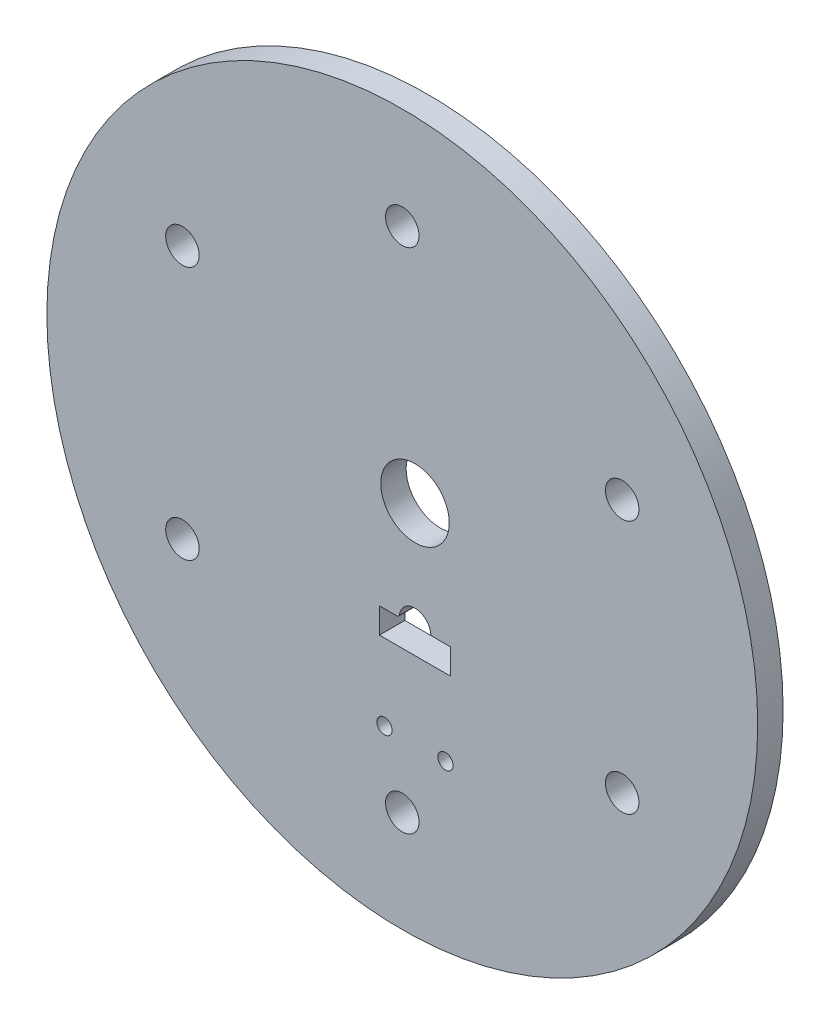
ISO-10303-21;
HEADER;
FILE_DESCRIPTION(('STEP AP214'),'2;1');
FILE_NAME('part.step','',(''),(''),'','','');
FILE_SCHEMA(('AUTOMOTIVE_DESIGN { 1 0 10303 214 1 1 1 1 }'));
ENDSEC;
DATA;
#1=APPLICATION_CONTEXT('core data for automotive mechanical design processes');
#2=APPLICATION_PROTOCOL_DEFINITION('international standard','automotive_design',2000,#1);
#3=PRODUCT_CONTEXT('',#1,'mechanical');
#4=PRODUCT('Part','Part','',(#3));
#5=PRODUCT_RELATED_PRODUCT_CATEGORY('part','',(#4));
#6=PRODUCT_DEFINITION_FORMATION('','',#4);
#7=PRODUCT_DEFINITION_CONTEXT('part definition',#1,'design');
#8=PRODUCT_DEFINITION('design','',#6,#7);
#9=PRODUCT_DEFINITION_SHAPE('','',#8);
#10=(LENGTH_UNIT() NAMED_UNIT(*) SI_UNIT(.MILLI.,.METRE.));
#11=(NAMED_UNIT(*) PLANE_ANGLE_UNIT() SI_UNIT($,.RADIAN.));
#12=(NAMED_UNIT(*) SI_UNIT($,.STERADIAN.) SOLID_ANGLE_UNIT());
#13=UNCERTAINTY_MEASURE_WITH_UNIT(LENGTH_MEASURE(1.E-05),#10,'distance_accuracy_value','');
#14=(GEOMETRIC_REPRESENTATION_CONTEXT(3) GLOBAL_UNCERTAINTY_ASSIGNED_CONTEXT((#13)) GLOBAL_UNIT_ASSIGNED_CONTEXT((#10,
#11,#12)) REPRESENTATION_CONTEXT('',''));
#15=CARTESIAN_POINT('',(0.,0.,0.));
#16=DIRECTION('',(0.,0.,1.));
#17=DIRECTION('',(1.,0.,0.));
#18=AXIS2_PLACEMENT_3D('',#15,#16,#17);
#19=CARTESIAN_POINT('',(9.5,-17.,5.));
#20=DIRECTION('',(0.,-1.,0.));
#21=DIRECTION('',(0.,0.,-1.));
#22=AXIS2_PLACEMENT_3D('',#19,#20,#21);
#23=PLANE('',#22);
#24=DIRECTION('',(-1.,0.,0.));
#25=VECTOR('',#24,1.);
#26=CARTESIAN_POINT('',(9.5,-17.,0.));
#27=LINE('',#26,#25);
#28=CARTESIAN_POINT('',(-1.06510869399518,-17.,0.));
#29=VERTEX_POINT('',#28);
#30=CARTESIAN_POINT('',(-4.5,-17.,0.));
#31=VERTEX_POINT('',#30);
#32=EDGE_CURVE('E147',#29,#31,#27,.T.);
#33=ORIENTED_EDGE('',*,*,#32,.F.);
#34=DIRECTION('',(0.,0.,1.));
#35=VECTOR('',#34,1.);
#36=CARTESIAN_POINT('',(-1.06510869399518,-17.,5.));
#37=LINE('',#36,#35);
#38=CARTESIAN_POINT('',(-1.06510869399518,-17.,5.));
#39=VERTEX_POINT('',#38);
#40=EDGE_CURVE('E64',#29,#39,#37,.T.);
#41=ORIENTED_EDGE('',*,*,#40,.T.);
#42=DIRECTION('',(-1.,0.,0.));
#43=VECTOR('',#42,1.);
#44=CARTESIAN_POINT('',(9.5,-17.,5.));
#45=LINE('',#44,#43);
#46=CARTESIAN_POINT('',(-4.5,-17.,5.));
#47=VERTEX_POINT('',#46);
#48=EDGE_CURVE('E134',#39,#47,#45,.T.);
#49=ORIENTED_EDGE('',*,*,#48,.T.);
#50=DIRECTION('',(0.,0.,-1.));
#51=VECTOR('',#50,1.);
#52=CARTESIAN_POINT('',(-4.5,-17.,5.));
#53=LINE('',#52,#51);
#54=EDGE_CURVE('E115',#47,#31,#53,.T.);
#55=ORIENTED_EDGE('',*,*,#54,.T.);
#56=EDGE_LOOP('',(#33,#41,#49,#55));
#57=FACE_BOUND('',#56,.T.);
#58=ADVANCED_FACE('F41',(#57),#23,.T.);
#59=CARTESIAN_POINT('',(0.,0.,5.));
#60=DIRECTION('',(0.,0.,1.));
#61=DIRECTION('',(1.,0.,0.));
#62=AXIS2_PLACEMENT_3D('',#59,#60,#61);
#63=PLANE('',#62);
#64=CARTESIAN_POINT('',(8.5,-37.,5.));
#65=DIRECTION('',(0.,0.,-1.));
#66=DIRECTION('',(-1.,0.,0.));
#67=AXIS2_PLACEMENT_3D('',#64,#65,#66);
#68=CIRCLE('',#67,1.5);
#69=CARTESIAN_POINT('',(7.,-37.,5.));
#70=VERTEX_POINT('',#69);
#71=EDGE_CURVE('E250',#70,#70,#68,.T.);
#72=ORIENTED_EDGE('',*,*,#71,.T.);
#73=EDGE_LOOP('',(#72));
#74=FACE_BOUND('',#73,.T.);
#75=CARTESIAN_POINT('',(-3.5,-37.,5.));
#76=DIRECTION('',(0.,0.,-1.));
#77=DIRECTION('',(-1.,0.,0.));
#78=AXIS2_PLACEMENT_3D('',#75,#76,#77);
#79=CIRCLE('',#78,1.5);
#80=CARTESIAN_POINT('',(-5.,-37.,5.));
#81=VERTEX_POINT('',#80);
#82=EDGE_CURVE('E254',#81,#81,#79,.T.);
#83=ORIENTED_EDGE('',*,*,#82,.T.);
#84=EDGE_LOOP('',(#83));
#85=FACE_BOUND('',#84,.T.);
#86=CARTESIAN_POINT('',(2.5,3.99999999999999,5.));
#87=DIRECTION('',(0.,0.,-1.));
#88=DIRECTION('',(-1.,0.,0.));
#89=AXIS2_PLACEMENT_3D('',#86,#87,#88);
#90=CIRCLE('',#89,6.74624);
#91=CARTESIAN_POINT('',(-4.24624,3.99999999999999,5.));
#92=VERTEX_POINT('',#91);
#93=EDGE_CURVE('E243',#92,#92,#90,.T.);
#94=ORIENTED_EDGE('',*,*,#93,.T.);
#95=EDGE_LOOP('',(#94));
#96=FACE_BOUND('',#95,.T.);
#97=ORIENTED_EDGE('',*,*,#48,.F.);
#98=CARTESIAN_POINT('',(-1.06510869399518,-16.5,5.));
#99=DIRECTION('',(0.,0.,1.));
#100=DIRECTION('',(1.,0.,0.));
#101=AXIS2_PLACEMENT_3D('',#98,#99,#100);
#102=CIRCLE('',#101,0.5);
#103=CARTESIAN_POINT('',(-0.56995470871807,-16.5694444444444,5.));
#104=VERTEX_POINT('',#103);
#105=EDGE_CURVE('E49',#39,#104,#102,.T.);
#106=ORIENTED_EDGE('',*,*,#105,.T.);
#107=CARTESIAN_POINT('',(2.5,-17.,5.));
#108=DIRECTION('',(0.,0.,-1.));
#109=DIRECTION('',(-1.,0.,0.));
#110=AXIS2_PLACEMENT_3D('',#107,#108,#109);
#111=CIRCLE('',#110,3.1);
#112=CARTESIAN_POINT('',(5.56995470871807,-16.5694444444444,5.));
#113=VERTEX_POINT('',#112);
#114=EDGE_CURVE('E142',#104,#113,#111,.T.);
#115=ORIENTED_EDGE('',*,*,#114,.T.);
#116=CARTESIAN_POINT('',(6.06510869399518,-16.5,5.));
#117=DIRECTION('',(0.,0.,1.));
#118=DIRECTION('',(1.,0.,0.));
#119=AXIS2_PLACEMENT_3D('',#116,#117,#118);
#120=CIRCLE('',#119,0.5);
#121=CARTESIAN_POINT('',(6.06510869399518,-17.,5.));
#122=VERTEX_POINT('',#121);
#123=EDGE_CURVE('E56',#113,#122,#120,.T.);
#124=ORIENTED_EDGE('',*,*,#123,.T.);
#125=CARTESIAN_POINT('',(9.5,-17.,5.));
#126=VERTEX_POINT('',#125);
#127=EDGE_CURVE('E138',#126,#122,#45,.T.);
#128=ORIENTED_EDGE('',*,*,#127,.F.);
#129=DIRECTION('',(0.,1.,0.));
#130=VECTOR('',#129,1.);
#131=CARTESIAN_POINT('',(9.5,-17.,5.));
#132=LINE('',#131,#130);
#133=CARTESIAN_POINT('',(9.5,-22.,5.));
#134=VERTEX_POINT('',#133);
#135=EDGE_CURVE('E132',#134,#126,#132,.T.);
#136=ORIENTED_EDGE('',*,*,#135,.F.);
#137=DIRECTION('',(1.,0.,0.));
#138=VECTOR('',#137,1.);
#139=CARTESIAN_POINT('',(9.5,-22.,5.));
#140=LINE('',#139,#138);
#141=CARTESIAN_POINT('',(-4.5,-22.,5.));
#142=VERTEX_POINT('',#141);
#143=EDGE_CURVE('E117',#142,#134,#140,.T.);
#144=ORIENTED_EDGE('',*,*,#143,.F.);
#145=DIRECTION('',(0.,-1.,0.));
#146=VECTOR('',#145,1.);
#147=CARTESIAN_POINT('',(-4.5,-17.,5.));
#148=LINE('',#147,#146);
#149=EDGE_CURVE('E108',#47,#142,#148,.T.);
#150=ORIENTED_EDGE('',*,*,#149,.F.);
#151=EDGE_LOOP('',(#97,#106,#115,#124,#128,#136,#144,#150));
#152=FACE_BOUND('',#151,.T.);
#153=CARTESIAN_POINT('',(0.,50.,5.));
#154=DIRECTION('',(0.,0.,1.));
#155=DIRECTION('',(1.,0.,0.));
#156=AXIS2_PLACEMENT_3D('',#153,#154,#155);
#157=CIRCLE('',#156,3.3);
#158=CARTESIAN_POINT('',(3.3,50.,5.));
#159=VERTEX_POINT('',#158);
#160=EDGE_CURVE('E125',#159,#159,#157,.T.);
#161=ORIENTED_EDGE('',*,*,#160,.F.);
#162=EDGE_LOOP('',(#161));
#163=FACE_BOUND('',#162,.T.);
#164=CARTESIAN_POINT('',(43.301270189222,24.9999999999999,5.));
#165=DIRECTION('',(0.,0.,1.));
#166=DIRECTION('',(1.,0.,0.));
#167=AXIS2_PLACEMENT_3D('',#164,#165,#166);
#168=CIRCLE('',#167,3.3);
#169=CARTESIAN_POINT('',(46.601270189222,24.9999999999999,5.));
#170=VERTEX_POINT('',#169);
#171=EDGE_CURVE('E159',#170,#170,#168,.T.);
#172=ORIENTED_EDGE('',*,*,#171,.F.);
#173=EDGE_LOOP('',(#172));
#174=FACE_BOUND('',#173,.T.);
#175=CARTESIAN_POINT('',(43.3012701892218,-25.0000000000002,5.));
#176=DIRECTION('',(0.,0.,1.));
#177=DIRECTION('',(1.,0.,0.));
#178=AXIS2_PLACEMENT_3D('',#175,#176,#177);
#179=CIRCLE('',#178,3.3);
#180=CARTESIAN_POINT('',(46.6012701892218,-25.0000000000002,5.));
#181=VERTEX_POINT('',#180);
#182=EDGE_CURVE('E165',#181,#181,#179,.T.);
#183=ORIENTED_EDGE('',*,*,#182,.F.);
#184=EDGE_LOOP('',(#183));
#185=FACE_BOUND('',#184,.T.);
#186=CARTESIAN_POINT('',(0.,-50.,5.));
#187=DIRECTION('',(0.,0.,1.));
#188=DIRECTION('',(1.,0.,0.));
#189=AXIS2_PLACEMENT_3D('',#186,#187,#188);
#190=CIRCLE('',#189,3.3);
#191=CARTESIAN_POINT('',(3.3,-50.,5.));
#192=VERTEX_POINT('',#191);
#193=EDGE_CURVE('E171',#192,#192,#190,.T.);
#194=ORIENTED_EDGE('',*,*,#193,.F.);
#195=EDGE_LOOP('',(#194));
#196=FACE_BOUND('',#195,.T.);
#197=CARTESIAN_POINT('',(-43.3012701892222,-24.9999999999996,5.));
#198=DIRECTION('',(0.,0.,1.));
#199=DIRECTION('',(1.,0.,0.));
#200=AXIS2_PLACEMENT_3D('',#197,#198,#199);
#201=CIRCLE('',#200,3.3);
#202=CARTESIAN_POINT('',(-40.0012701892222,-24.9999999999996,5.));
#203=VERTEX_POINT('',#202);
#204=EDGE_CURVE('E177',#203,#203,#201,.T.);
#205=ORIENTED_EDGE('',*,*,#204,.F.);
#206=EDGE_LOOP('',(#205));
#207=FACE_BOUND('',#206,.T.);
#208=CARTESIAN_POINT('',(-43.3012701892216,25.0000000000005,5.));
#209=DIRECTION('',(0.,0.,1.));
#210=DIRECTION('',(1.,0.,0.));
#211=AXIS2_PLACEMENT_3D('',#208,#209,#210);
#212=CIRCLE('',#211,3.3);
#213=CARTESIAN_POINT('',(-40.0012701892216,25.0000000000005,5.));
#214=VERTEX_POINT('',#213);
#215=EDGE_CURVE('E183',#214,#214,#212,.T.);
#216=ORIENTED_EDGE('',*,*,#215,.F.);
#217=EDGE_LOOP('',(#216));
#218=FACE_BOUND('',#217,.T.);
#219=CARTESIAN_POINT('',(0.,0.,5.));
#220=DIRECTION('',(0.,0.,1.));
#221=DIRECTION('',(1.,0.,0.));
#222=AXIS2_PLACEMENT_3D('',#219,#220,#221);
#223=CIRCLE('',#222,70.);
#224=CARTESIAN_POINT('',(70.,0.,5.));
#225=VERTEX_POINT('',#224);
#226=EDGE_CURVE('E190',#225,#225,#223,.T.);
#227=ORIENTED_EDGE('',*,*,#226,.T.);
#228=EDGE_LOOP('',(#227));
#229=FACE_BOUND('',#228,.T.);
#230=ADVANCED_FACE('F129',(#74,#85,#96,#152,#163,#174,#185,#196,#207,#218,#229),#63,.T.);
#231=CARTESIAN_POINT('',(0.,0.,0.));
#232=DIRECTION('',(0.,0.,1.));
#233=DIRECTION('',(1.,0.,0.));
#234=AXIS2_PLACEMENT_3D('',#231,#232,#233);
#235=PLANE('',#234);
#236=CARTESIAN_POINT('',(8.5,-37.,0.));
#237=DIRECTION('',(0.,0.,-1.));
#238=DIRECTION('',(-1.,0.,0.));
#239=AXIS2_PLACEMENT_3D('',#236,#237,#238);
#240=CIRCLE('',#239,1.5);
#241=CARTESIAN_POINT('',(7.,-37.,0.));
#242=VERTEX_POINT('',#241);
#243=EDGE_CURVE('E257',#242,#242,#240,.T.);
#244=ORIENTED_EDGE('',*,*,#243,.F.);
#245=EDGE_LOOP('',(#244));
#246=FACE_BOUND('',#245,.T.);
#247=CARTESIAN_POINT('',(-3.5,-37.,0.));
#248=DIRECTION('',(0.,0.,-1.));
#249=DIRECTION('',(-1.,0.,0.));
#250=AXIS2_PLACEMENT_3D('',#247,#248,#249);
#251=CIRCLE('',#250,1.5);
#252=CARTESIAN_POINT('',(-5.,-37.,0.));
#253=VERTEX_POINT('',#252);
#254=EDGE_CURVE('E251',#253,#253,#251,.T.);
#255=ORIENTED_EDGE('',*,*,#254,.F.);
#256=EDGE_LOOP('',(#255));
#257=FACE_BOUND('',#256,.T.);
#258=CARTESIAN_POINT('',(2.5,3.99999999999999,0.));
#259=DIRECTION('',(0.,0.,-1.));
#260=DIRECTION('',(-1.,0.,0.));
#261=AXIS2_PLACEMENT_3D('',#258,#259,#260);
#262=CIRCLE('',#261,6.74624);
#263=CARTESIAN_POINT('',(-4.24624,3.99999999999999,0.));
#264=VERTEX_POINT('',#263);
#265=EDGE_CURVE('E245',#264,#264,#262,.T.);
#266=ORIENTED_EDGE('',*,*,#265,.F.);
#267=EDGE_LOOP('',(#266));
#268=FACE_BOUND('',#267,.T.);
#269=CARTESIAN_POINT('',(0.,0.,0.));
#270=DIRECTION('',(0.,0.,1.));
#271=DIRECTION('',(1.,0.,0.));
#272=AXIS2_PLACEMENT_3D('',#269,#270,#271);
#273=CIRCLE('',#272,70.);
#274=CARTESIAN_POINT('',(70.,0.,0.));
#275=VERTEX_POINT('',#274);
#276=EDGE_CURVE('E189',#275,#275,#273,.T.);
#277=ORIENTED_EDGE('',*,*,#276,.F.);
#278=EDGE_LOOP('',(#277));
#279=FACE_BOUND('',#278,.T.);
#280=CARTESIAN_POINT('',(-43.3012701892216,25.0000000000005,0.));
#281=DIRECTION('',(0.,0.,1.));
#282=DIRECTION('',(1.,0.,0.));
#283=AXIS2_PLACEMENT_3D('',#280,#281,#282);
#284=CIRCLE('',#283,3.3);
#285=CARTESIAN_POINT('',(-40.0012701892216,25.0000000000005,0.));
#286=VERTEX_POINT('',#285);
#287=EDGE_CURVE('E186',#286,#286,#284,.T.);
#288=ORIENTED_EDGE('',*,*,#287,.T.);
#289=EDGE_LOOP('',(#288));
#290=FACE_BOUND('',#289,.T.);
#291=CARTESIAN_POINT('',(-43.3012701892222,-24.9999999999996,0.));
#292=DIRECTION('',(0.,0.,1.));
#293=DIRECTION('',(1.,0.,0.));
#294=AXIS2_PLACEMENT_3D('',#291,#292,#293);
#295=CIRCLE('',#294,3.3);
#296=CARTESIAN_POINT('',(-40.0012701892222,-24.9999999999996,0.));
#297=VERTEX_POINT('',#296);
#298=EDGE_CURVE('E180',#297,#297,#295,.T.);
#299=ORIENTED_EDGE('',*,*,#298,.T.);
#300=EDGE_LOOP('',(#299));
#301=FACE_BOUND('',#300,.T.);
#302=CARTESIAN_POINT('',(0.,-50.,0.));
#303=DIRECTION('',(0.,0.,1.));
#304=DIRECTION('',(1.,0.,0.));
#305=AXIS2_PLACEMENT_3D('',#302,#303,#304);
#306=CIRCLE('',#305,3.3);
#307=CARTESIAN_POINT('',(3.3,-50.,0.));
#308=VERTEX_POINT('',#307);
#309=EDGE_CURVE('E174',#308,#308,#306,.T.);
#310=ORIENTED_EDGE('',*,*,#309,.T.);
#311=EDGE_LOOP('',(#310));
#312=FACE_BOUND('',#311,.T.);
#313=CARTESIAN_POINT('',(43.3012701892218,-25.0000000000002,0.));
#314=DIRECTION('',(0.,0.,1.));
#315=DIRECTION('',(1.,0.,0.));
#316=AXIS2_PLACEMENT_3D('',#313,#314,#315);
#317=CIRCLE('',#316,3.3);
#318=CARTESIAN_POINT('',(46.6012701892218,-25.0000000000002,0.));
#319=VERTEX_POINT('',#318);
#320=EDGE_CURVE('E168',#319,#319,#317,.T.);
#321=ORIENTED_EDGE('',*,*,#320,.T.);
#322=EDGE_LOOP('',(#321));
#323=FACE_BOUND('',#322,.T.);
#324=CARTESIAN_POINT('',(43.301270189222,24.9999999999999,0.));
#325=DIRECTION('',(0.,0.,1.));
#326=DIRECTION('',(1.,0.,0.));
#327=AXIS2_PLACEMENT_3D('',#324,#325,#326);
#328=CIRCLE('',#327,3.3);
#329=CARTESIAN_POINT('',(46.601270189222,24.9999999999999,0.));
#330=VERTEX_POINT('',#329);
#331=EDGE_CURVE('E162',#330,#330,#328,.T.);
#332=ORIENTED_EDGE('',*,*,#331,.T.);
#333=EDGE_LOOP('',(#332));
#334=FACE_BOUND('',#333,.T.);
#335=CARTESIAN_POINT('',(0.,50.,0.));
#336=DIRECTION('',(0.,0.,1.));
#337=DIRECTION('',(1.,0.,0.));
#338=AXIS2_PLACEMENT_3D('',#335,#336,#337);
#339=CIRCLE('',#338,3.3);
#340=CARTESIAN_POINT('',(3.3,50.,0.));
#341=VERTEX_POINT('',#340);
#342=EDGE_CURVE('E156',#341,#341,#339,.T.);
#343=ORIENTED_EDGE('',*,*,#342,.T.);
#344=EDGE_LOOP('',(#343));
#345=FACE_BOUND('',#344,.T.);
#346=CARTESIAN_POINT('',(2.5,-17.,0.));
#347=DIRECTION('',(0.,0.,-1.));
#348=DIRECTION('',(-1.,0.,0.));
#349=AXIS2_PLACEMENT_3D('',#346,#347,#348);
#350=CIRCLE('',#349,3.1);
#351=CARTESIAN_POINT('',(-0.56995470871807,-16.5694444444444,0.));
#352=VERTEX_POINT('',#351);
#353=CARTESIAN_POINT('',(5.56995470871807,-16.5694444444444,0.));
#354=VERTEX_POINT('',#353);
#355=EDGE_CURVE('E215',#352,#354,#350,.T.);
#356=ORIENTED_EDGE('',*,*,#355,.F.);
#357=CARTESIAN_POINT('',(-1.06510869399518,-16.5,0.));
#358=DIRECTION('',(0.,0.,1.));
#359=DIRECTION('',(1.,0.,0.));
#360=AXIS2_PLACEMENT_3D('',#357,#358,#359);
#361=CIRCLE('',#360,0.5);
#362=EDGE_CURVE('E203',#352,#29,#361,.F.);
#363=ORIENTED_EDGE('',*,*,#362,.T.);
#364=ORIENTED_EDGE('',*,*,#32,.T.);
#365=DIRECTION('',(0.,-1.,0.));
#366=VECTOR('',#365,1.);
#367=CARTESIAN_POINT('',(-4.5,-17.,0.));
#368=LINE('',#367,#366);
#369=CARTESIAN_POINT('',(-4.5,-22.,0.));
#370=VERTEX_POINT('',#369);
#371=EDGE_CURVE('E140',#31,#370,#368,.T.);
#372=ORIENTED_EDGE('',*,*,#371,.T.);
#373=DIRECTION('',(1.,0.,0.));
#374=VECTOR('',#373,1.);
#375=CARTESIAN_POINT('',(9.5,-22.,0.));
#376=LINE('',#375,#374);
#377=CARTESIAN_POINT('',(9.5,-22.,0.));
#378=VERTEX_POINT('',#377);
#379=EDGE_CURVE('E124',#370,#378,#376,.T.);
#380=ORIENTED_EDGE('',*,*,#379,.T.);
#381=DIRECTION('',(0.,1.,0.));
#382=VECTOR('',#381,1.);
#383=CARTESIAN_POINT('',(9.5,-17.,0.));
#384=LINE('',#383,#382);
#385=CARTESIAN_POINT('',(9.5,-17.,0.));
#386=VERTEX_POINT('',#385);
#387=EDGE_CURVE('E144',#378,#386,#384,.T.);
#388=ORIENTED_EDGE('',*,*,#387,.T.);
#389=CARTESIAN_POINT('',(6.06510869399518,-17.,0.));
#390=VERTEX_POINT('',#389);
#391=EDGE_CURVE('E118',#386,#390,#27,.T.);
#392=ORIENTED_EDGE('',*,*,#391,.T.);
#393=CARTESIAN_POINT('',(6.06510869399518,-16.5,0.));
#394=DIRECTION('',(0.,0.,1.));
#395=DIRECTION('',(1.,0.,0.));
#396=AXIS2_PLACEMENT_3D('',#393,#394,#395);
#397=CIRCLE('',#396,0.5);
#398=EDGE_CURVE('E201',#390,#354,#397,.F.);
#399=ORIENTED_EDGE('',*,*,#398,.T.);
#400=EDGE_LOOP('',(#356,#363,#364,#372,#380,#388,#392,#399));
#401=FACE_BOUND('',#400,.T.);
#402=ADVANCED_FACE('F219',(#246,#257,#268,#279,#290,#301,#312,#323,#334,#345,#401),#235,.F.);
#403=CARTESIAN_POINT('',(0.,0.,5.));
#404=DIRECTION('',(0.,0.,-1.));
#405=DIRECTION('',(-1.,0.,0.));
#406=AXIS2_PLACEMENT_3D('',#403,#404,#405);
#407=CYLINDRICAL_SURFACE('',#406,70.);
#408=ORIENTED_EDGE('',*,*,#226,.F.);
#409=EDGE_LOOP('',(#408));
#410=FACE_BOUND('',#409,.T.);
#411=ORIENTED_EDGE('',*,*,#276,.T.);
#412=EDGE_LOOP('',(#411));
#413=FACE_BOUND('',#412,.T.);
#414=ADVANCED_FACE('F273',(#410,#413),#407,.T.);
#415=CARTESIAN_POINT('',(-43.3012701892216,25.0000000000005,5.));
#416=DIRECTION('',(0.,0.,1.));
#417=DIRECTION('',(1.,0.,0.));
#418=AXIS2_PLACEMENT_3D('',#415,#416,#417);
#419=CYLINDRICAL_SURFACE('',#418,3.3);
#420=ORIENTED_EDGE('',*,*,#287,.F.);
#421=EDGE_LOOP('',(#420));
#422=FACE_BOUND('',#421,.T.);
#423=ORIENTED_EDGE('',*,*,#215,.T.);
#424=EDGE_LOOP('',(#423));
#425=FACE_BOUND('',#424,.T.);
#426=ADVANCED_FACE('F314',(#422,#425),#419,.F.);
#427=CARTESIAN_POINT('',(-43.3012701892222,-24.9999999999996,5.));
#428=DIRECTION('',(0.,0.,1.));
#429=DIRECTION('',(1.,0.,0.));
#430=AXIS2_PLACEMENT_3D('',#427,#428,#429);
#431=CYLINDRICAL_SURFACE('',#430,3.3);
#432=ORIENTED_EDGE('',*,*,#298,.F.);
#433=EDGE_LOOP('',(#432));
#434=FACE_BOUND('',#433,.T.);
#435=ORIENTED_EDGE('',*,*,#204,.T.);
#436=EDGE_LOOP('',(#435));
#437=FACE_BOUND('',#436,.T.);
#438=ADVANCED_FACE('F319',(#434,#437),#431,.F.);
#439=CARTESIAN_POINT('',(0.,-50.,5.));
#440=DIRECTION('',(0.,0.,1.));
#441=DIRECTION('',(1.,0.,0.));
#442=AXIS2_PLACEMENT_3D('',#439,#440,#441);
#443=CYLINDRICAL_SURFACE('',#442,3.3);
#444=ORIENTED_EDGE('',*,*,#309,.F.);
#445=EDGE_LOOP('',(#444));
#446=FACE_BOUND('',#445,.T.);
#447=ORIENTED_EDGE('',*,*,#193,.T.);
#448=EDGE_LOOP('',(#447));
#449=FACE_BOUND('',#448,.T.);
#450=ADVANCED_FACE('F427',(#446,#449),#443,.F.);
#451=CARTESIAN_POINT('',(43.3012701892218,-25.0000000000002,5.));
#452=DIRECTION('',(0.,0.,1.));
#453=DIRECTION('',(1.,0.,0.));
#454=AXIS2_PLACEMENT_3D('',#451,#452,#453);
#455=CYLINDRICAL_SURFACE('',#454,3.3);
#456=ORIENTED_EDGE('',*,*,#320,.F.);
#457=EDGE_LOOP('',(#456));
#458=FACE_BOUND('',#457,.T.);
#459=ORIENTED_EDGE('',*,*,#182,.T.);
#460=EDGE_LOOP('',(#459));
#461=FACE_BOUND('',#460,.T.);
#462=ADVANCED_FACE('F418',(#458,#461),#455,.F.);
#463=CARTESIAN_POINT('',(43.301270189222,24.9999999999999,5.));
#464=DIRECTION('',(0.,0.,1.));
#465=DIRECTION('',(1.,0.,0.));
#466=AXIS2_PLACEMENT_3D('',#463,#464,#465);
#467=CYLINDRICAL_SURFACE('',#466,3.3);
#468=ORIENTED_EDGE('',*,*,#331,.F.);
#469=EDGE_LOOP('',(#468));
#470=FACE_BOUND('',#469,.T.);
#471=ORIENTED_EDGE('',*,*,#171,.T.);
#472=EDGE_LOOP('',(#471));
#473=FACE_BOUND('',#472,.T.);
#474=ADVANCED_FACE('F296',(#470,#473),#467,.F.);
#475=CARTESIAN_POINT('',(0.,50.,5.));
#476=DIRECTION('',(0.,0.,1.));
#477=DIRECTION('',(1.,0.,0.));
#478=AXIS2_PLACEMENT_3D('',#475,#476,#477);
#479=CYLINDRICAL_SURFACE('',#478,3.3);
#480=ORIENTED_EDGE('',*,*,#342,.F.);
#481=EDGE_LOOP('',(#480));
#482=FACE_BOUND('',#481,.T.);
#483=ORIENTED_EDGE('',*,*,#160,.T.);
#484=EDGE_LOOP('',(#483));
#485=FACE_BOUND('',#484,.T.);
#486=ADVANCED_FACE('F293',(#482,#485),#479,.F.);
#487=CARTESIAN_POINT('',(-4.5,-17.,5.));
#488=DIRECTION('',(1.,0.,0.));
#489=DIRECTION('',(0.,1.,0.));
#490=AXIS2_PLACEMENT_3D('',#487,#488,#489);
#491=PLANE('',#490);
#492=ORIENTED_EDGE('',*,*,#371,.F.);
#493=ORIENTED_EDGE('',*,*,#54,.F.);
#494=ORIENTED_EDGE('',*,*,#149,.T.);
#495=DIRECTION('',(0.,0.,-1.));
#496=VECTOR('',#495,1.);
#497=CARTESIAN_POINT('',(-4.5,-22.,5.));
#498=LINE('',#497,#496);
#499=EDGE_CURVE('E112',#142,#370,#498,.T.);
#500=ORIENTED_EDGE('',*,*,#499,.T.);
#501=EDGE_LOOP('',(#492,#493,#494,#500));
#502=FACE_BOUND('',#501,.T.);
#503=ADVANCED_FACE('F111',(#502),#491,.T.);
#504=CARTESIAN_POINT('',(9.5,-22.,5.));
#505=DIRECTION('',(0.,1.,0.));
#506=DIRECTION('',(0.,0.,1.));
#507=AXIS2_PLACEMENT_3D('',#504,#505,#506);
#508=PLANE('',#507);
#509=ORIENTED_EDGE('',*,*,#379,.F.);
#510=ORIENTED_EDGE('',*,*,#499,.F.);
#511=ORIENTED_EDGE('',*,*,#143,.T.);
#512=DIRECTION('',(0.,0.,-1.));
#513=VECTOR('',#512,1.);
#514=CARTESIAN_POINT('',(9.5,-22.,5.));
#515=LINE('',#514,#513);
#516=EDGE_CURVE('E126',#134,#378,#515,.T.);
#517=ORIENTED_EDGE('',*,*,#516,.T.);
#518=EDGE_LOOP('',(#509,#510,#511,#517));
#519=FACE_BOUND('',#518,.T.);
#520=ADVANCED_FACE('F121',(#519),#508,.T.);
#521=CARTESIAN_POINT('',(9.5,-17.,5.));
#522=DIRECTION('',(-1.,0.,0.));
#523=DIRECTION('',(0.,0.,1.));
#524=AXIS2_PLACEMENT_3D('',#521,#522,#523);
#525=PLANE('',#524);
#526=ORIENTED_EDGE('',*,*,#387,.F.);
#527=ORIENTED_EDGE('',*,*,#516,.F.);
#528=ORIENTED_EDGE('',*,*,#135,.T.);
#529=DIRECTION('',(0.,0.,-1.));
#530=VECTOR('',#529,1.);
#531=CARTESIAN_POINT('',(9.5,-17.,5.));
#532=LINE('',#531,#530);
#533=EDGE_CURVE('E151',#126,#386,#532,.T.);
#534=ORIENTED_EDGE('',*,*,#533,.T.);
#535=EDGE_LOOP('',(#526,#527,#528,#534));
#536=FACE_BOUND('',#535,.T.);
#537=ADVANCED_FACE('F231',(#536),#525,.T.);
#538=ORIENTED_EDGE('',*,*,#127,.T.);
#539=DIRECTION('',(0.,0.,1.));
#540=VECTOR('',#539,1.);
#541=CARTESIAN_POINT('',(6.06510869399518,-17.,0.));
#542=LINE('',#541,#540);
#543=EDGE_CURVE('E11',#122,#390,#542,.F.);
#544=ORIENTED_EDGE('',*,*,#543,.T.);
#545=ORIENTED_EDGE('',*,*,#391,.F.);
#546=ORIENTED_EDGE('',*,*,#533,.F.);
#547=EDGE_LOOP('',(#538,#544,#545,#546));
#548=FACE_BOUND('',#547,.T.);
#549=ADVANCED_FACE('F222',(#548),#23,.T.);
#550=CARTESIAN_POINT('',(2.5,-17.,5.));
#551=DIRECTION('',(0.,0.,-1.));
#552=DIRECTION('',(-1.,0.,0.));
#553=AXIS2_PLACEMENT_3D('',#550,#551,#552);
#554=CYLINDRICAL_SURFACE('',#553,3.1);
#555=ORIENTED_EDGE('',*,*,#114,.F.);
#556=DIRECTION('',(0.,0.,-1.));
#557=VECTOR('',#556,1.);
#558=CARTESIAN_POINT('',(-0.56995470871807,-16.5694444444444,5.));
#559=LINE('',#558,#557);
#560=EDGE_CURVE('E198',#104,#352,#559,.T.);
#561=ORIENTED_EDGE('',*,*,#560,.T.);
#562=ORIENTED_EDGE('',*,*,#355,.T.);
#563=DIRECTION('',(0.,0.,-1.));
#564=VECTOR('',#563,1.);
#565=CARTESIAN_POINT('',(5.56995470871807,-16.5694444444444,5.));
#566=LINE('',#565,#564);
#567=EDGE_CURVE('E193',#354,#113,#566,.F.);
#568=ORIENTED_EDGE('',*,*,#567,.T.);
#569=EDGE_LOOP('',(#555,#561,#562,#568));
#570=FACE_BOUND('',#569,.T.);
#571=ADVANCED_FACE('F211',(#570),#554,.F.);
#572=CARTESIAN_POINT('',(2.5,3.99999999999999,0.));
#573=DIRECTION('',(0.,0.,-1.));
#574=DIRECTION('',(-1.,0.,0.));
#575=AXIS2_PLACEMENT_3D('',#572,#573,#574);
#576=CYLINDRICAL_SURFACE('',#575,6.74624);
#577=ORIENTED_EDGE('',*,*,#93,.F.);
#578=EDGE_LOOP('',(#577));
#579=FACE_BOUND('',#578,.T.);
#580=ORIENTED_EDGE('',*,*,#265,.T.);
#581=EDGE_LOOP('',(#580));
#582=FACE_BOUND('',#581,.T.);
#583=ADVANCED_FACE('F237',(#579,#582),#576,.F.);
#584=CARTESIAN_POINT('',(-1.06510869399518,-16.5,5.));
#585=DIRECTION('',(0.,0.,-1.));
#586=DIRECTION('',(-1.,0.,0.));
#587=AXIS2_PLACEMENT_3D('',#584,#585,#586);
#588=CYLINDRICAL_SURFACE('',#587,0.5);
#589=ORIENTED_EDGE('',*,*,#105,.F.);
#590=ORIENTED_EDGE('',*,*,#40,.F.);
#591=ORIENTED_EDGE('',*,*,#362,.F.);
#592=ORIENTED_EDGE('',*,*,#560,.F.);
#593=EDGE_LOOP('',(#589,#590,#591,#592));
#594=FACE_BOUND('',#593,.T.);
#595=ADVANCED_FACE('F217',(#594),#588,.T.);
#596=CARTESIAN_POINT('',(6.06510869399518,-16.5,5.));
#597=DIRECTION('',(0.,0.,-1.));
#598=DIRECTION('',(-1.,0.,0.));
#599=AXIS2_PLACEMENT_3D('',#596,#597,#598);
#600=CYLINDRICAL_SURFACE('',#599,0.5);
#601=ORIENTED_EDGE('',*,*,#398,.F.);
#602=ORIENTED_EDGE('',*,*,#543,.F.);
#603=ORIENTED_EDGE('',*,*,#123,.F.);
#604=ORIENTED_EDGE('',*,*,#567,.F.);
#605=EDGE_LOOP('',(#601,#602,#603,#604));
#606=FACE_BOUND('',#605,.T.);
#607=ADVANCED_FACE('F43',(#606),#600,.T.);
#608=CARTESIAN_POINT('',(-3.5,-37.,5.));
#609=DIRECTION('',(0.,0.,-1.));
#610=DIRECTION('',(-1.,0.,0.));
#611=AXIS2_PLACEMENT_3D('',#608,#609,#610);
#612=CYLINDRICAL_SURFACE('',#611,1.5);
#613=ORIENTED_EDGE('',*,*,#82,.F.);
#614=EDGE_LOOP('',(#613));
#615=FACE_BOUND('',#614,.T.);
#616=ORIENTED_EDGE('',*,*,#254,.T.);
#617=EDGE_LOOP('',(#616));
#618=FACE_BOUND('',#617,.T.);
#619=ADVANCED_FACE('F267',(#615,#618),#612,.F.);
#620=CARTESIAN_POINT('',(8.5,-37.,5.));
#621=DIRECTION('',(0.,0.,-1.));
#622=DIRECTION('',(-1.,0.,0.));
#623=AXIS2_PLACEMENT_3D('',#620,#621,#622);
#624=CYLINDRICAL_SURFACE('',#623,1.5);
#625=ORIENTED_EDGE('',*,*,#71,.F.);
#626=EDGE_LOOP('',(#625));
#627=FACE_BOUND('',#626,.T.);
#628=ORIENTED_EDGE('',*,*,#243,.T.);
#629=EDGE_LOOP('',(#628));
#630=FACE_BOUND('',#629,.T.);
#631=ADVANCED_FACE('F264',(#627,#630),#624,.F.);
#632=CLOSED_SHELL('',(#58,#230,#402,#414,#426,#438,#450,#462,#474,#486,#503,#520,#537,#549,#571,
#583,#595,#607,#619,#631));
#633=MANIFOLD_SOLID_BREP('B2',#632);
#634=ADVANCED_BREP_SHAPE_REPRESENTATION('',(#18,#633),#14);
#635=SHAPE_DEFINITION_REPRESENTATION(#9,#634);
ENDSEC;
END-ISO-10303-21;
